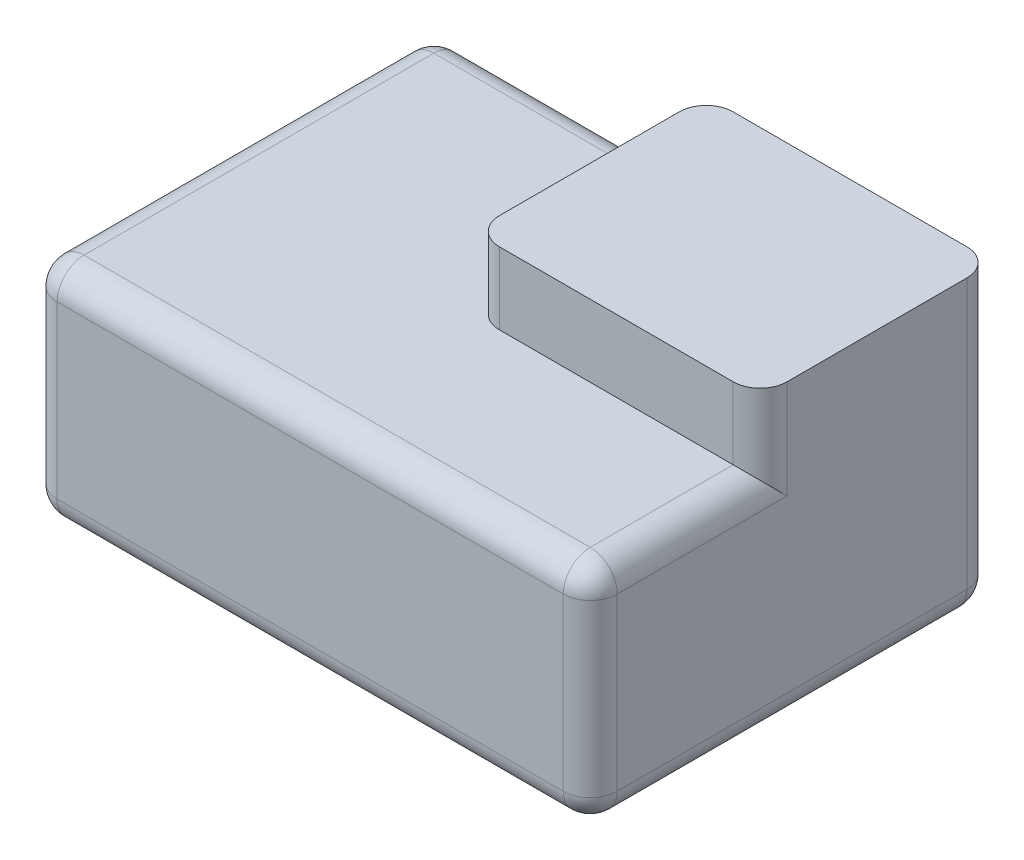
ISO-10303-21;
HEADER;
FILE_DESCRIPTION(('STEP AP214'),'2;1');
FILE_NAME('part.step','',(''),(''),'','','');
FILE_SCHEMA(('AUTOMOTIVE_DESIGN { 1 0 10303 214 1 1 1 1 }'));
ENDSEC;
DATA;
#1=APPLICATION_CONTEXT('core data for automotive mechanical design processes');
#2=APPLICATION_PROTOCOL_DEFINITION('international standard','automotive_design',2000,#1);
#3=PRODUCT_CONTEXT('',#1,'mechanical');
#4=PRODUCT('Part','Part','',(#3));
#5=PRODUCT_RELATED_PRODUCT_CATEGORY('part','',(#4));
#6=PRODUCT_DEFINITION_FORMATION('','',#4);
#7=PRODUCT_DEFINITION_CONTEXT('part definition',#1,'design');
#8=PRODUCT_DEFINITION('design','',#6,#7);
#9=PRODUCT_DEFINITION_SHAPE('','',#8);
#10=(LENGTH_UNIT() NAMED_UNIT(*) SI_UNIT(.MILLI.,.METRE.));
#11=(NAMED_UNIT(*) PLANE_ANGLE_UNIT() SI_UNIT($,.RADIAN.));
#12=(NAMED_UNIT(*) SI_UNIT($,.STERADIAN.) SOLID_ANGLE_UNIT());
#13=UNCERTAINTY_MEASURE_WITH_UNIT(LENGTH_MEASURE(1.E-05),#10,'distance_accuracy_value','');
#14=(GEOMETRIC_REPRESENTATION_CONTEXT(3) GLOBAL_UNCERTAINTY_ASSIGNED_CONTEXT((#13)) GLOBAL_UNIT_ASSIGNED_CONTEXT((#10,
#11,#12)) REPRESENTATION_CONTEXT('',''));
#15=CARTESIAN_POINT('',(0.,0.,0.));
#16=DIRECTION('',(0.,0.,1.));
#17=DIRECTION('',(1.,0.,0.));
#18=AXIS2_PLACEMENT_3D('',#15,#16,#17);
#19=CARTESIAN_POINT('',(0.,33.,0.));
#20=DIRECTION('',(1.,0.,0.));
#21=DIRECTION('',(0.,0.,-1.));
#22=AXIS2_PLACEMENT_3D('',#19,#20,#21);
#23=PLANE('',#22);
#24=DIRECTION('',(0.,0.,1.));
#25=VECTOR('',#24,1.);
#26=CARTESIAN_POINT('',(0.,22.,-44.9));
#27=LINE('',#26,#25);
#28=CARTESIAN_POINT('',(0.,22.,-3.));
#29=VERTEX_POINT('',#28);
#30=CARTESIAN_POINT('',(0.,22.,-41.9));
#31=VERTEX_POINT('',#30);
#32=EDGE_CURVE('E167',#29,#31,#27,.F.);
#33=ORIENTED_EDGE('',*,*,#32,.T.);
#34=DIRECTION('',(0.,-1.,0.));
#35=VECTOR('',#34,1.);
#36=CARTESIAN_POINT('',(0.,33.,-41.9));
#37=LINE('',#36,#35);
#38=CARTESIAN_POINT('',(0.,3.,-41.9));
#39=VERTEX_POINT('',#38);
#40=EDGE_CURVE('E163',#31,#39,#37,.T.);
#41=ORIENTED_EDGE('',*,*,#40,.T.);
#42=DIRECTION('',(0.,0.,1.));
#43=VECTOR('',#42,1.);
#44=CARTESIAN_POINT('',(0.,3.,0.));
#45=LINE('',#44,#43);
#46=CARTESIAN_POINT('',(0.,3.,-3.));
#47=VERTEX_POINT('',#46);
#48=EDGE_CURVE('E158',#39,#47,#45,.T.);
#49=ORIENTED_EDGE('',*,*,#48,.T.);
#50=DIRECTION('',(0.,-1.,0.));
#51=VECTOR('',#50,1.);
#52=CARTESIAN_POINT('',(0.,33.,-3.));
#53=LINE('',#52,#51);
#54=EDGE_CURVE('E160',#47,#29,#53,.F.);
#55=ORIENTED_EDGE('',*,*,#54,.T.);
#56=EDGE_LOOP('',(#33,#41,#49,#55));
#57=FACE_BOUND('',#56,.T.);
#58=ADVANCED_FACE('F34',(#57),#23,.F.);
#59=CARTESIAN_POINT('',(0.,33.,0.));
#60=DIRECTION('',(0.,0.,-1.));
#61=DIRECTION('',(-1.,0.,0.));
#62=AXIS2_PLACEMENT_3D('',#59,#60,#61);
#63=PLANE('',#62);
#64=DIRECTION('',(1.,0.,0.));
#65=VECTOR('',#64,1.);
#66=CARTESIAN_POINT('',(62.3,3.,0.));
#67=LINE('',#66,#65);
#68=CARTESIAN_POINT('',(3.,3.,0.));
#69=VERTEX_POINT('',#68);
#70=CARTESIAN_POINT('',(59.3,3.,0.));
#71=VERTEX_POINT('',#70);
#72=EDGE_CURVE('E297',#69,#71,#67,.T.);
#73=ORIENTED_EDGE('',*,*,#72,.T.);
#74=DIRECTION('',(0.,-1.,0.));
#75=VECTOR('',#74,1.);
#76=CARTESIAN_POINT('',(59.3,33.,0.));
#77=LINE('',#76,#75);
#78=CARTESIAN_POINT('',(59.3,22.,0.));
#79=VERTEX_POINT('',#78);
#80=EDGE_CURVE('E299',#71,#79,#77,.F.);
#81=ORIENTED_EDGE('',*,*,#80,.T.);
#82=DIRECTION('',(1.,0.,0.));
#83=VECTOR('',#82,1.);
#84=CARTESIAN_POINT('',(0.,22.,0.));
#85=LINE('',#84,#83);
#86=CARTESIAN_POINT('',(3.,22.,0.));
#87=VERTEX_POINT('',#86);
#88=EDGE_CURVE('E293',#79,#87,#85,.F.);
#89=ORIENTED_EDGE('',*,*,#88,.T.);
#90=DIRECTION('',(0.,-1.,0.));
#91=VECTOR('',#90,1.);
#92=CARTESIAN_POINT('',(3.,33.,0.));
#93=LINE('',#92,#91);
#94=EDGE_CURVE('E295',#87,#69,#93,.T.);
#95=ORIENTED_EDGE('',*,*,#94,.T.);
#96=EDGE_LOOP('',(#73,#81,#89,#95));
#97=FACE_BOUND('',#96,.T.);
#98=ADVANCED_FACE('F392',(#97),#63,.F.);
#99=CARTESIAN_POINT('',(0.,33.,-44.9));
#100=DIRECTION('',(0.,0.,1.));
#101=DIRECTION('',(1.,0.,0.));
#102=AXIS2_PLACEMENT_3D('',#99,#100,#101);
#103=PLANE('',#102);
#104=DIRECTION('',(-1.,0.,0.));
#105=VECTOR('',#104,1.);
#106=CARTESIAN_POINT('',(30.3,22.,-44.9));
#107=LINE('',#106,#105);
#108=CARTESIAN_POINT('',(3.,22.,-44.9));
#109=VERTEX_POINT('',#108);
#110=CARTESIAN_POINT('',(33.3,22.,-44.9));
#111=VERTEX_POINT('',#110);
#112=EDGE_CURVE('E263',#109,#111,#107,.F.);
#113=ORIENTED_EDGE('',*,*,#112,.T.);
#114=DIRECTION('',(0.,1.,0.));
#115=VECTOR('',#114,1.);
#116=CARTESIAN_POINT('',(33.3,33.,-44.9));
#117=LINE('',#116,#115);
#118=CARTESIAN_POINT('',(33.3,33.,-44.9));
#119=VERTEX_POINT('',#118);
#120=EDGE_CURVE('E265',#111,#119,#117,.T.);
#121=ORIENTED_EDGE('',*,*,#120,.T.);
#122=DIRECTION('',(-1.,0.,0.));
#123=VECTOR('',#122,1.);
#124=CARTESIAN_POINT('',(0.,33.,-44.9));
#125=LINE('',#124,#123);
#126=CARTESIAN_POINT('',(59.3,33.,-44.9));
#127=VERTEX_POINT('',#126);
#128=EDGE_CURVE('E179',#127,#119,#125,.T.);
#129=ORIENTED_EDGE('',*,*,#128,.F.);
#130=DIRECTION('',(0.,-1.,0.));
#131=VECTOR('',#130,1.);
#132=CARTESIAN_POINT('',(59.3,33.,-44.9));
#133=LINE('',#132,#131);
#134=CARTESIAN_POINT('',(59.3,3.,-44.9));
#135=VERTEX_POINT('',#134);
#136=EDGE_CURVE('E256',#127,#135,#133,.T.);
#137=ORIENTED_EDGE('',*,*,#136,.T.);
#138=DIRECTION('',(-1.,0.,0.));
#139=VECTOR('',#138,1.);
#140=CARTESIAN_POINT('',(0.,3.,-44.9));
#141=LINE('',#140,#139);
#142=CARTESIAN_POINT('',(3.,3.,-44.9));
#143=VERTEX_POINT('',#142);
#144=EDGE_CURVE('E258',#135,#143,#141,.T.);
#145=ORIENTED_EDGE('',*,*,#144,.T.);
#146=DIRECTION('',(0.,-1.,0.));
#147=VECTOR('',#146,1.);
#148=CARTESIAN_POINT('',(3.,33.,-44.9));
#149=LINE('',#148,#147);
#150=EDGE_CURVE('E260',#143,#109,#149,.F.);
#151=ORIENTED_EDGE('',*,*,#150,.T.);
#152=EDGE_LOOP('',(#113,#121,#129,#137,#145,#151));
#153=FACE_BOUND('',#152,.T.);
#154=ADVANCED_FACE('F342',(#153),#103,.F.);
#155=CARTESIAN_POINT('',(0.,33.,0.));
#156=DIRECTION('',(0.,-1.,0.));
#157=DIRECTION('',(0.,0.,-1.));
#158=AXIS2_PLACEMENT_3D('',#155,#156,#157);
#159=PLANE('',#158);
#160=ORIENTED_EDGE('',*,*,#128,.T.);
#161=CARTESIAN_POINT('',(33.3,33.,-41.9));
#162=DIRECTION('',(0.,-1.,0.));
#163=DIRECTION('',(0.,0.,-1.));
#164=AXIS2_PLACEMENT_3D('',#161,#162,#163);
#165=CIRCLE('',#164,3.);
#166=CARTESIAN_POINT('',(30.3,33.,-41.9));
#167=VERTEX_POINT('',#166);
#168=EDGE_CURVE('E307',#119,#167,#165,.F.);
#169=ORIENTED_EDGE('',*,*,#168,.T.);
#170=DIRECTION('',(0.,0.,1.));
#171=VECTOR('',#170,1.);
#172=CARTESIAN_POINT('',(30.3,33.,0.));
#173=LINE('',#172,#171);
#174=CARTESIAN_POINT('',(30.3,33.,-21.9));
#175=VERTEX_POINT('',#174);
#176=EDGE_CURVE('E235',#167,#175,#173,.T.);
#177=ORIENTED_EDGE('',*,*,#176,.T.);
#178=CARTESIAN_POINT('',(33.3,33.,-21.9));
#179=DIRECTION('',(0.,-1.,0.));
#180=DIRECTION('',(0.,0.,-1.));
#181=AXIS2_PLACEMENT_3D('',#178,#179,#180);
#182=CIRCLE('',#181,3.);
#183=CARTESIAN_POINT('',(33.3,33.,-18.9));
#184=VERTEX_POINT('',#183);
#185=EDGE_CURVE('E51',#175,#184,#182,.F.);
#186=ORIENTED_EDGE('',*,*,#185,.T.);
#187=DIRECTION('',(-1.,0.,0.));
#188=VECTOR('',#187,1.);
#189=CARTESIAN_POINT('',(0.,33.,-18.9));
#190=LINE('',#189,#188);
#191=CARTESIAN_POINT('',(59.3,33.,-18.9));
#192=VERTEX_POINT('',#191);
#193=EDGE_CURVE('E240',#192,#184,#190,.T.);
#194=ORIENTED_EDGE('',*,*,#193,.F.);
#195=CARTESIAN_POINT('',(59.3,33.,-21.9));
#196=DIRECTION('',(0.,-1.,0.));
#197=DIRECTION('',(0.,0.,-1.));
#198=AXIS2_PLACEMENT_3D('',#195,#196,#197);
#199=CIRCLE('',#198,3.);
#200=CARTESIAN_POINT('',(62.3,33.,-21.9));
#201=VERTEX_POINT('',#200);
#202=EDGE_CURVE('E302',#192,#201,#199,.F.);
#203=ORIENTED_EDGE('',*,*,#202,.T.);
#204=DIRECTION('',(0.,0.,-1.));
#205=VECTOR('',#204,1.);
#206=CARTESIAN_POINT('',(62.3,33.,0.));
#207=LINE('',#206,#205);
#208=CARTESIAN_POINT('',(62.3,33.,-41.9));
#209=VERTEX_POINT('',#208);
#210=EDGE_CURVE('E249',#201,#209,#207,.T.);
#211=ORIENTED_EDGE('',*,*,#210,.T.);
#212=CARTESIAN_POINT('',(59.3,33.,-41.9));
#213=DIRECTION('',(0.,-1.,0.));
#214=DIRECTION('',(0.,0.,-1.));
#215=AXIS2_PLACEMENT_3D('',#212,#213,#214);
#216=CIRCLE('',#215,3.);
#217=EDGE_CURVE('E304',#209,#127,#216,.F.);
#218=ORIENTED_EDGE('',*,*,#217,.T.);
#219=EDGE_LOOP('',(#160,#169,#177,#186,#194,#203,#211,#218));
#220=FACE_BOUND('',#219,.T.);
#221=ADVANCED_FACE('F374',(#220),#159,.F.);
#222=CARTESIAN_POINT('',(62.3,33.,0.));
#223=DIRECTION('',(-1.,0.,0.));
#224=DIRECTION('',(0.,0.,1.));
#225=AXIS2_PLACEMENT_3D('',#222,#223,#224);
#226=PLANE('',#225);
#227=DIRECTION('',(0.,0.,-1.));
#228=VECTOR('',#227,1.);
#229=CARTESIAN_POINT('',(62.3,3.,-44.9));
#230=LINE('',#229,#228);
#231=CARTESIAN_POINT('',(62.3,3.,-3.));
#232=VERTEX_POINT('',#231);
#233=CARTESIAN_POINT('',(62.3,3.,-41.9));
#234=VERTEX_POINT('',#233);
#235=EDGE_CURVE('E281',#232,#234,#230,.T.);
#236=ORIENTED_EDGE('',*,*,#235,.T.);
#237=DIRECTION('',(0.,-1.,0.));
#238=VECTOR('',#237,1.);
#239=CARTESIAN_POINT('',(62.3,33.,-41.9));
#240=LINE('',#239,#238);
#241=EDGE_CURVE('E283',#234,#209,#240,.F.);
#242=ORIENTED_EDGE('',*,*,#241,.T.);
#243=ORIENTED_EDGE('',*,*,#210,.F.);
#244=DIRECTION('',(0.,1.,0.));
#245=VECTOR('',#244,1.);
#246=CARTESIAN_POINT('',(62.3,33.,-21.9));
#247=LINE('',#246,#245);
#248=CARTESIAN_POINT('',(62.3,22.,-21.9));
#249=VERTEX_POINT('',#248);
#250=EDGE_CURVE('E275',#201,#249,#247,.F.);
#251=ORIENTED_EDGE('',*,*,#250,.T.);
#252=DIRECTION('',(0.,0.,-1.));
#253=VECTOR('',#252,1.);
#254=CARTESIAN_POINT('',(62.3,22.,0.));
#255=LINE('',#254,#253);
#256=CARTESIAN_POINT('',(62.3,22.,-3.));
#257=VERTEX_POINT('',#256);
#258=EDGE_CURVE('E277',#249,#257,#255,.F.);
#259=ORIENTED_EDGE('',*,*,#258,.T.);
#260=DIRECTION('',(0.,-1.,0.));
#261=VECTOR('',#260,1.);
#262=CARTESIAN_POINT('',(62.3,33.,-3.));
#263=LINE('',#262,#261);
#264=EDGE_CURVE('E279',#257,#232,#263,.T.);
#265=ORIENTED_EDGE('',*,*,#264,.T.);
#266=EDGE_LOOP('',(#236,#242,#243,#251,#259,#265));
#267=FACE_BOUND('',#266,.T.);
#268=ADVANCED_FACE('F372',(#267),#226,.F.);
#269=CARTESIAN_POINT('',(0.,0.,0.));
#270=DIRECTION('',(0.,-1.,0.));
#271=DIRECTION('',(0.,0.,-1.));
#272=AXIS2_PLACEMENT_3D('',#269,#270,#271);
#273=PLANE('',#272);
#274=DIRECTION('',(-1.,0.,0.));
#275=VECTOR('',#274,1.);
#276=CARTESIAN_POINT('',(62.3,0.,-41.9));
#277=LINE('',#276,#275);
#278=CARTESIAN_POINT('',(3.,0.,-41.9));
#279=VERTEX_POINT('',#278);
#280=CARTESIAN_POINT('',(59.3,0.,-41.9));
#281=VERTEX_POINT('',#280);
#282=EDGE_CURVE('E288',#279,#281,#277,.F.);
#283=ORIENTED_EDGE('',*,*,#282,.T.);
#284=DIRECTION('',(0.,0.,-1.));
#285=VECTOR('',#284,1.);
#286=CARTESIAN_POINT('',(59.3,0.,0.));
#287=LINE('',#286,#285);
#288=CARTESIAN_POINT('',(59.3,0.,-3.));
#289=VERTEX_POINT('',#288);
#290=EDGE_CURVE('E290',#281,#289,#287,.F.);
#291=ORIENTED_EDGE('',*,*,#290,.T.);
#292=DIRECTION('',(1.,0.,0.));
#293=VECTOR('',#292,1.);
#294=CARTESIAN_POINT('',(0.,0.,-3.));
#295=LINE('',#294,#293);
#296=CARTESIAN_POINT('',(3.,0.,-3.));
#297=VERTEX_POINT('',#296);
#298=EDGE_CURVE('E285',#289,#297,#295,.F.);
#299=ORIENTED_EDGE('',*,*,#298,.T.);
#300=DIRECTION('',(0.,0.,1.));
#301=VECTOR('',#300,1.);
#302=CARTESIAN_POINT('',(3.,0.,-44.9));
#303=LINE('',#302,#301);
#304=EDGE_CURVE('E190',#297,#279,#303,.F.);
#305=ORIENTED_EDGE('',*,*,#304,.T.);
#306=EDGE_LOOP('',(#283,#291,#299,#305));
#307=FACE_BOUND('',#306,.T.);
#308=ADVANCED_FACE('F356',(#307),#273,.T.);
#309=CARTESIAN_POINT('',(30.3,25.,0.));
#310=DIRECTION('',(-1.,0.,0.));
#311=DIRECTION('',(0.,0.,1.));
#312=AXIS2_PLACEMENT_3D('',#309,#310,#311);
#313=PLANE('',#312);
#314=ORIENTED_EDGE('',*,*,#176,.F.);
#315=DIRECTION('',(0.,1.,0.));
#316=VECTOR('',#315,1.);
#317=CARTESIAN_POINT('',(30.3,25.,-41.9));
#318=LINE('',#317,#316);
#319=CARTESIAN_POINT('',(30.3,25.,-41.9));
#320=VERTEX_POINT('',#319);
#321=EDGE_CURVE('E312',#167,#320,#318,.F.);
#322=ORIENTED_EDGE('',*,*,#321,.T.);
#323=DIRECTION('',(0.,0.,1.));
#324=VECTOR('',#323,1.);
#325=CARTESIAN_POINT('',(30.3,25.,0.));
#326=LINE('',#325,#324);
#327=CARTESIAN_POINT('',(30.3,25.,-21.9));
#328=VERTEX_POINT('',#327);
#329=EDGE_CURVE('E243',#320,#328,#326,.T.);
#330=ORIENTED_EDGE('',*,*,#329,.T.);
#331=DIRECTION('',(0.,1.,0.));
#332=VECTOR('',#331,1.);
#333=CARTESIAN_POINT('',(30.3,33.,-21.9));
#334=LINE('',#333,#332);
#335=EDGE_CURVE('E309',#328,#175,#334,.T.);
#336=ORIENTED_EDGE('',*,*,#335,.T.);
#337=EDGE_LOOP('',(#314,#322,#330,#336));
#338=FACE_BOUND('',#337,.T.);
#339=ADVANCED_FACE('F596',(#338),#313,.T.);
#340=CARTESIAN_POINT('',(0.,25.,-18.9));
#341=DIRECTION('',(0.,0.,-1.));
#342=DIRECTION('',(-1.,0.,0.));
#343=AXIS2_PLACEMENT_3D('',#340,#341,#342);
#344=PLANE('',#343);
#345=ORIENTED_EDGE('',*,*,#193,.T.);
#346=DIRECTION('',(0.,1.,0.));
#347=VECTOR('',#346,1.);
#348=CARTESIAN_POINT('',(33.3,25.,-18.9));
#349=LINE('',#348,#347);
#350=CARTESIAN_POINT('',(33.3,25.,-18.9));
#351=VERTEX_POINT('',#350);
#352=EDGE_CURVE('E43',#184,#351,#349,.F.);
#353=ORIENTED_EDGE('',*,*,#352,.T.);
#354=DIRECTION('',(-1.,0.,0.));
#355=VECTOR('',#354,1.);
#356=CARTESIAN_POINT('',(0.,25.,-18.9));
#357=LINE('',#356,#355);
#358=CARTESIAN_POINT('',(59.3,25.,-18.9));
#359=VERTEX_POINT('',#358);
#360=EDGE_CURVE('E246',#359,#351,#357,.T.);
#361=ORIENTED_EDGE('',*,*,#360,.F.);
#362=DIRECTION('',(0.,1.,0.));
#363=VECTOR('',#362,1.);
#364=CARTESIAN_POINT('',(59.3,25.,-18.9));
#365=LINE('',#364,#363);
#366=EDGE_CURVE('E58',#359,#192,#365,.T.);
#367=ORIENTED_EDGE('',*,*,#366,.T.);
#368=EDGE_LOOP('',(#345,#353,#361,#367));
#369=FACE_BOUND('',#368,.T.);
#370=ADVANCED_FACE('F587',(#369),#344,.F.);
#371=CARTESIAN_POINT('',(0.,25.,0.));
#372=DIRECTION('',(0.,1.,0.));
#373=DIRECTION('',(0.,0.,1.));
#374=AXIS2_PLACEMENT_3D('',#371,#372,#373);
#375=PLANE('',#374);
#376=DIRECTION('',(1.,0.,0.));
#377=VECTOR('',#376,1.);
#378=CARTESIAN_POINT('',(62.3,25.,-3.));
#379=LINE('',#378,#377);
#380=CARTESIAN_POINT('',(3.,25.,-3.));
#381=VERTEX_POINT('',#380);
#382=CARTESIAN_POINT('',(59.3,25.,-3.));
#383=VERTEX_POINT('',#382);
#384=EDGE_CURVE('E271',#381,#383,#379,.T.);
#385=ORIENTED_EDGE('',*,*,#384,.T.);
#386=DIRECTION('',(0.,0.,-1.));
#387=VECTOR('',#386,1.);
#388=CARTESIAN_POINT('',(59.3,25.,-18.9));
#389=LINE('',#388,#387);
#390=EDGE_CURVE('E273',#383,#359,#389,.T.);
#391=ORIENTED_EDGE('',*,*,#390,.T.);
#392=ORIENTED_EDGE('',*,*,#360,.T.);
#393=CARTESIAN_POINT('',(33.3,25.,-21.9));
#394=DIRECTION('',(0.,1.,0.));
#395=DIRECTION('',(0.,0.,1.));
#396=AXIS2_PLACEMENT_3D('',#393,#394,#395);
#397=CIRCLE('',#396,3.);
#398=EDGE_CURVE('E11',#351,#328,#397,.F.);
#399=ORIENTED_EDGE('',*,*,#398,.T.);
#400=ORIENTED_EDGE('',*,*,#329,.F.);
#401=DIRECTION('',(-1.,0.,0.));
#402=VECTOR('',#401,1.);
#403=CARTESIAN_POINT('',(0.,25.,-41.9));
#404=LINE('',#403,#402);
#405=CARTESIAN_POINT('',(3.,25.,-41.9));
#406=VERTEX_POINT('',#405);
#407=EDGE_CURVE('E267',#320,#406,#404,.T.);
#408=ORIENTED_EDGE('',*,*,#407,.T.);
#409=DIRECTION('',(0.,0.,1.));
#410=VECTOR('',#409,1.);
#411=CARTESIAN_POINT('',(3.,25.,0.));
#412=LINE('',#411,#410);
#413=EDGE_CURVE('E269',#406,#381,#412,.T.);
#414=ORIENTED_EDGE('',*,*,#413,.T.);
#415=EDGE_LOOP('',(#385,#391,#392,#399,#400,#408,#414));
#416=FACE_BOUND('',#415,.T.);
#417=ADVANCED_FACE('F580',(#416),#375,.T.);
#418=CARTESIAN_POINT('',(59.3,25.,-21.9));
#419=DIRECTION('',(0.,1.,0.));
#420=DIRECTION('',(0.,0.,1.));
#421=AXIS2_PLACEMENT_3D('',#418,#419,#420);
#422=CYLINDRICAL_SURFACE('',#421,3.);
#423=ORIENTED_EDGE('',*,*,#202,.F.);
#424=ORIENTED_EDGE('',*,*,#366,.F.);
#425=CARTESIAN_POINT('',(59.3,22.,-21.9));
#426=DIRECTION('',(0.,-0.707106781186547,0.707106781186547));
#427=DIRECTION('',(0.,0.707106781186547,0.707106781186547));
#428=AXIS2_PLACEMENT_3D('',#425,#426,#427);
#429=ELLIPSE('',#428,4.24264068711928,3.);
#430=EDGE_CURVE('E38',#249,#359,#429,.T.);
#431=ORIENTED_EDGE('',*,*,#430,.F.);
#432=ORIENTED_EDGE('',*,*,#250,.F.);
#433=EDGE_LOOP('',(#423,#424,#431,#432));
#434=FACE_BOUND('',#433,.T.);
#435=ADVANCED_FACE('F378',(#434),#422,.T.);
#436=CARTESIAN_POINT('',(59.3,22.,0.));
#437=DIRECTION('',(0.,0.,1.));
#438=DIRECTION('',(1.,0.,0.));
#439=AXIS2_PLACEMENT_3D('',#436,#437,#438);
#440=CYLINDRICAL_SURFACE('',#439,3.);
#441=ORIENTED_EDGE('',*,*,#430,.T.);
#442=ORIENTED_EDGE('',*,*,#390,.F.);
#443=CARTESIAN_POINT('',(59.3,22.,-3.));
#444=DIRECTION('',(0.,0.,1.));
#445=DIRECTION('',(1.,0.,0.));
#446=AXIS2_PLACEMENT_3D('',#443,#444,#445);
#447=CIRCLE('',#446,3.);
#448=EDGE_CURVE('E229',#257,#383,#447,.T.);
#449=ORIENTED_EDGE('',*,*,#448,.F.);
#450=ORIENTED_EDGE('',*,*,#258,.F.);
#451=EDGE_LOOP('',(#441,#442,#449,#450));
#452=FACE_BOUND('',#451,.T.);
#453=ADVANCED_FACE('F385',(#452),#440,.T.);
#454=CARTESIAN_POINT('',(59.3,33.,-3.));
#455=DIRECTION('',(0.,-1.,0.));
#456=DIRECTION('',(0.,0.,-1.));
#457=AXIS2_PLACEMENT_3D('',#454,#455,#456);
#458=CYLINDRICAL_SURFACE('',#457,3.);
#459=CARTESIAN_POINT('',(59.3,3.,-3.));
#460=DIRECTION('',(0.,-1.,0.));
#461=DIRECTION('',(0.,0.,-1.));
#462=AXIS2_PLACEMENT_3D('',#459,#460,#461);
#463=CIRCLE('',#462,3.);
#464=EDGE_CURVE('E224',#232,#71,#463,.T.);
#465=ORIENTED_EDGE('',*,*,#464,.F.);
#466=ORIENTED_EDGE('',*,*,#264,.F.);
#467=CARTESIAN_POINT('',(59.3,22.,-3.));
#468=DIRECTION('',(0.,1.,0.));
#469=DIRECTION('',(0.,0.,1.));
#470=AXIS2_PLACEMENT_3D('',#467,#468,#469);
#471=CIRCLE('',#470,3.);
#472=EDGE_CURVE('E227',#79,#257,#471,.T.);
#473=ORIENTED_EDGE('',*,*,#472,.F.);
#474=ORIENTED_EDGE('',*,*,#80,.F.);
#475=EDGE_LOOP('',(#465,#466,#473,#474));
#476=FACE_BOUND('',#475,.T.);
#477=ADVANCED_FACE('F383',(#476),#458,.T.);
#478=CARTESIAN_POINT('',(59.3,22.,-3.));
#479=DIRECTION('',(0.,0.,1.));
#480=DIRECTION('',(1.,0.,0.));
#481=AXIS2_PLACEMENT_3D('',#478,#479,#480);
#482=SPHERICAL_SURFACE('',#481,3.);
#483=ORIENTED_EDGE('',*,*,#472,.T.);
#484=ORIENTED_EDGE('',*,*,#448,.T.);
#485=CARTESIAN_POINT('',(59.3,22.,-3.));
#486=DIRECTION('',(1.,0.,0.));
#487=DIRECTION('',(0.,0.,-1.));
#488=AXIS2_PLACEMENT_3D('',#485,#486,#487);
#489=CIRCLE('',#488,3.);
#490=EDGE_CURVE('E221',#79,#383,#489,.F.);
#491=ORIENTED_EDGE('',*,*,#490,.F.);
#492=EDGE_LOOP('',(#483,#484,#491));
#493=FACE_BOUND('',#492,.T.);
#494=ADVANCED_FACE('F386',(#493),#482,.T.);
#495=CARTESIAN_POINT('',(59.3,3.,-3.));
#496=DIRECTION('',(0.,0.,1.));
#497=DIRECTION('',(1.,0.,0.));
#498=AXIS2_PLACEMENT_3D('',#495,#496,#497);
#499=SPHERICAL_SURFACE('',#498,3.);
#500=CARTESIAN_POINT('',(59.3,3.,-3.));
#501=DIRECTION('',(0.,0.,1.));
#502=DIRECTION('',(1.,0.,0.));
#503=AXIS2_PLACEMENT_3D('',#500,#501,#502);
#504=CIRCLE('',#503,3.);
#505=EDGE_CURVE('E215',#232,#289,#504,.F.);
#506=ORIENTED_EDGE('',*,*,#505,.F.);
#507=ORIENTED_EDGE('',*,*,#464,.T.);
#508=CARTESIAN_POINT('',(59.3,3.,-3.));
#509=DIRECTION('',(1.,0.,0.));
#510=DIRECTION('',(0.,0.,-1.));
#511=AXIS2_PLACEMENT_3D('',#508,#509,#510);
#512=CIRCLE('',#511,3.);
#513=EDGE_CURVE('E218',#289,#71,#512,.F.);
#514=ORIENTED_EDGE('',*,*,#513,.F.);
#515=EDGE_LOOP('',(#506,#507,#514));
#516=FACE_BOUND('',#515,.T.);
#517=ADVANCED_FACE('F396',(#516),#499,.T.);
#518=CARTESIAN_POINT('',(0.,22.,-3.));
#519=DIRECTION('',(-1.,0.,0.));
#520=DIRECTION('',(0.,0.,1.));
#521=AXIS2_PLACEMENT_3D('',#518,#519,#520);
#522=CYLINDRICAL_SURFACE('',#521,3.);
#523=ORIENTED_EDGE('',*,*,#490,.T.);
#524=ORIENTED_EDGE('',*,*,#384,.F.);
#525=CARTESIAN_POINT('',(3.,22.,-3.));
#526=DIRECTION('',(-1.,0.,0.));
#527=DIRECTION('',(0.,0.,1.));
#528=AXIS2_PLACEMENT_3D('',#525,#526,#527);
#529=CIRCLE('',#528,3.);
#530=EDGE_CURVE('E212',#87,#381,#529,.T.);
#531=ORIENTED_EDGE('',*,*,#530,.F.);
#532=ORIENTED_EDGE('',*,*,#88,.F.);
#533=EDGE_LOOP('',(#523,#524,#531,#532));
#534=FACE_BOUND('',#533,.T.);
#535=ADVANCED_FACE('F389',(#534),#522,.T.);
#536=CARTESIAN_POINT('',(3.,33.,-3.));
#537=DIRECTION('',(0.,-1.,0.));
#538=DIRECTION('',(0.,0.,-1.));
#539=AXIS2_PLACEMENT_3D('',#536,#537,#538);
#540=CYLINDRICAL_SURFACE('',#539,3.);
#541=CARTESIAN_POINT('',(3.,3.,-3.));
#542=DIRECTION('',(0.,-1.,0.));
#543=DIRECTION('',(0.,0.,-1.));
#544=AXIS2_PLACEMENT_3D('',#541,#542,#543);
#545=CIRCLE('',#544,3.);
#546=EDGE_CURVE('E174',#69,#47,#545,.T.);
#547=ORIENTED_EDGE('',*,*,#546,.F.);
#548=ORIENTED_EDGE('',*,*,#94,.F.);
#549=CARTESIAN_POINT('',(3.,22.,-3.));
#550=DIRECTION('',(0.,1.,0.));
#551=DIRECTION('',(0.,0.,1.));
#552=AXIS2_PLACEMENT_3D('',#549,#550,#551);
#553=CIRCLE('',#552,3.);
#554=EDGE_CURVE('E177',#29,#87,#553,.T.);
#555=ORIENTED_EDGE('',*,*,#554,.F.);
#556=ORIENTED_EDGE('',*,*,#54,.F.);
#557=EDGE_LOOP('',(#547,#548,#555,#556));
#558=FACE_BOUND('',#557,.T.);
#559=ADVANCED_FACE('F172',(#558),#540,.T.);
#560=CARTESIAN_POINT('',(0.,3.,-3.));
#561=DIRECTION('',(-1.,0.,0.));
#562=DIRECTION('',(0.,0.,1.));
#563=AXIS2_PLACEMENT_3D('',#560,#561,#562);
#564=CYLINDRICAL_SURFACE('',#563,3.);
#565=ORIENTED_EDGE('',*,*,#513,.T.);
#566=ORIENTED_EDGE('',*,*,#72,.F.);
#567=CARTESIAN_POINT('',(3.,3.,-3.));
#568=DIRECTION('',(-1.,0.,0.));
#569=DIRECTION('',(0.,0.,1.));
#570=AXIS2_PLACEMENT_3D('',#567,#568,#569);
#571=CIRCLE('',#570,3.);
#572=EDGE_CURVE('E187',#297,#69,#571,.T.);
#573=ORIENTED_EDGE('',*,*,#572,.F.);
#574=ORIENTED_EDGE('',*,*,#298,.F.);
#575=EDGE_LOOP('',(#565,#566,#573,#574));
#576=FACE_BOUND('',#575,.T.);
#577=ADVANCED_FACE('F398',(#576),#564,.T.);
#578=CARTESIAN_POINT('',(59.3,3.,0.));
#579=DIRECTION('',(0.,0.,1.));
#580=DIRECTION('',(1.,0.,0.));
#581=AXIS2_PLACEMENT_3D('',#578,#579,#580);
#582=CYLINDRICAL_SURFACE('',#581,3.);
#583=ORIENTED_EDGE('',*,*,#505,.T.);
#584=ORIENTED_EDGE('',*,*,#290,.F.);
#585=CARTESIAN_POINT('',(59.3,3.,-41.9));
#586=DIRECTION('',(0.,0.,-1.));
#587=DIRECTION('',(-1.,0.,0.));
#588=AXIS2_PLACEMENT_3D('',#585,#586,#587);
#589=CIRCLE('',#588,3.);
#590=EDGE_CURVE('E207',#234,#281,#589,.T.);
#591=ORIENTED_EDGE('',*,*,#590,.F.);
#592=ORIENTED_EDGE('',*,*,#235,.F.);
#593=EDGE_LOOP('',(#583,#584,#591,#592));
#594=FACE_BOUND('',#593,.T.);
#595=ADVANCED_FACE('F359',(#594),#582,.T.);
#596=CARTESIAN_POINT('',(59.3,33.,-41.9));
#597=DIRECTION('',(0.,-1.,0.));
#598=DIRECTION('',(0.,0.,-1.));
#599=AXIS2_PLACEMENT_3D('',#596,#597,#598);
#600=CYLINDRICAL_SURFACE('',#599,3.);
#601=ORIENTED_EDGE('',*,*,#217,.F.);
#602=ORIENTED_EDGE('',*,*,#241,.F.);
#603=CARTESIAN_POINT('',(59.3,3.,-41.9));
#604=DIRECTION('',(0.,-1.,0.));
#605=DIRECTION('',(0.,0.,-1.));
#606=AXIS2_PLACEMENT_3D('',#603,#604,#605);
#607=CIRCLE('',#606,3.);
#608=EDGE_CURVE('E204',#135,#234,#607,.T.);
#609=ORIENTED_EDGE('',*,*,#608,.F.);
#610=ORIENTED_EDGE('',*,*,#136,.F.);
#611=EDGE_LOOP('',(#601,#602,#609,#610));
#612=FACE_BOUND('',#611,.T.);
#613=ADVANCED_FACE('F369',(#612),#600,.T.);
#614=CARTESIAN_POINT('',(33.3,33.,-41.9));
#615=DIRECTION('',(0.,-1.,0.));
#616=DIRECTION('',(0.,0.,-1.));
#617=AXIS2_PLACEMENT_3D('',#614,#615,#616);
#618=CYLINDRICAL_SURFACE('',#617,3.);
#619=ORIENTED_EDGE('',*,*,#168,.F.);
#620=ORIENTED_EDGE('',*,*,#120,.F.);
#621=CARTESIAN_POINT('',(33.3,22.,-41.9));
#622=DIRECTION('',(-0.707106781186547,-0.707106781186547,0.));
#623=DIRECTION('',(0.707106781186547,-0.707106781186547,0.));
#624=AXIS2_PLACEMENT_3D('',#621,#622,#623);
#625=ELLIPSE('',#624,4.24264068711928,3.);
#626=EDGE_CURVE('E195',#320,#111,#625,.T.);
#627=ORIENTED_EDGE('',*,*,#626,.F.);
#628=ORIENTED_EDGE('',*,*,#321,.F.);
#629=EDGE_LOOP('',(#619,#620,#627,#628));
#630=FACE_BOUND('',#629,.T.);
#631=ADVANCED_FACE('F438',(#630),#618,.T.);
#632=CARTESIAN_POINT('',(3.,22.,-3.));
#633=DIRECTION('',(0.,0.,1.));
#634=DIRECTION('',(1.,0.,0.));
#635=AXIS2_PLACEMENT_3D('',#632,#633,#634);
#636=SPHERICAL_SURFACE('',#635,3.);
#637=ORIENTED_EDGE('',*,*,#554,.T.);
#638=ORIENTED_EDGE('',*,*,#530,.T.);
#639=CARTESIAN_POINT('',(3.,22.,-3.));
#640=DIRECTION('',(0.,0.,1.));
#641=DIRECTION('',(1.,0.,0.));
#642=AXIS2_PLACEMENT_3D('',#639,#640,#641);
#643=CIRCLE('',#642,3.);
#644=EDGE_CURVE('E191',#29,#381,#643,.F.);
#645=ORIENTED_EDGE('',*,*,#644,.F.);
#646=EDGE_LOOP('',(#637,#638,#645));
#647=FACE_BOUND('',#646,.T.);
#648=ADVANCED_FACE('F435',(#647),#636,.T.);
#649=CARTESIAN_POINT('',(3.,3.,-3.));
#650=DIRECTION('',(0.,0.,1.));
#651=DIRECTION('',(1.,0.,0.));
#652=AXIS2_PLACEMENT_3D('',#649,#650,#651);
#653=SPHERICAL_SURFACE('',#652,3.);
#654=ORIENTED_EDGE('',*,*,#572,.T.);
#655=ORIENTED_EDGE('',*,*,#546,.T.);
#656=CARTESIAN_POINT('',(3.,3.,-3.));
#657=DIRECTION('',(0.,0.,1.));
#658=DIRECTION('',(1.,0.,0.));
#659=AXIS2_PLACEMENT_3D('',#656,#657,#658);
#660=CIRCLE('',#659,3.);
#661=EDGE_CURVE('E184',#297,#47,#660,.F.);
#662=ORIENTED_EDGE('',*,*,#661,.F.);
#663=EDGE_LOOP('',(#654,#655,#662));
#664=FACE_BOUND('',#663,.T.);
#665=ADVANCED_FACE('F183',(#664),#653,.T.);
#666=CARTESIAN_POINT('',(59.3,3.,-41.9));
#667=DIRECTION('',(0.,0.,1.));
#668=DIRECTION('',(1.,0.,0.));
#669=AXIS2_PLACEMENT_3D('',#666,#667,#668);
#670=SPHERICAL_SURFACE('',#669,3.);
#671=ORIENTED_EDGE('',*,*,#608,.T.);
#672=ORIENTED_EDGE('',*,*,#590,.T.);
#673=CARTESIAN_POINT('',(59.3,3.,-41.9));
#674=DIRECTION('',(1.,0.,0.));
#675=DIRECTION('',(0.,0.,-1.));
#676=AXIS2_PLACEMENT_3D('',#673,#674,#675);
#677=CIRCLE('',#676,3.);
#678=EDGE_CURVE('E192',#135,#281,#677,.F.);
#679=ORIENTED_EDGE('',*,*,#678,.F.);
#680=EDGE_LOOP('',(#671,#672,#679));
#681=FACE_BOUND('',#680,.T.);
#682=ADVANCED_FACE('F363',(#681),#670,.T.);
#683=CARTESIAN_POINT('',(0.,22.,-41.9));
#684=DIRECTION('',(1.,0.,0.));
#685=DIRECTION('',(0.,0.,-1.));
#686=AXIS2_PLACEMENT_3D('',#683,#684,#685);
#687=CYLINDRICAL_SURFACE('',#686,3.);
#688=ORIENTED_EDGE('',*,*,#626,.T.);
#689=ORIENTED_EDGE('',*,*,#112,.F.);
#690=CARTESIAN_POINT('',(3.,22.,-41.9));
#691=DIRECTION('',(-1.,0.,0.));
#692=DIRECTION('',(0.,0.,1.));
#693=AXIS2_PLACEMENT_3D('',#690,#691,#692);
#694=CIRCLE('',#693,3.);
#695=EDGE_CURVE('E198',#406,#109,#694,.T.);
#696=ORIENTED_EDGE('',*,*,#695,.F.);
#697=ORIENTED_EDGE('',*,*,#407,.F.);
#698=EDGE_LOOP('',(#688,#689,#696,#697));
#699=FACE_BOUND('',#698,.T.);
#700=ADVANCED_FACE('F337',(#699),#687,.T.);
#701=CARTESIAN_POINT('',(3.,22.,0.));
#702=DIRECTION('',(0.,0.,-1.));
#703=DIRECTION('',(-1.,0.,0.));
#704=AXIS2_PLACEMENT_3D('',#701,#702,#703);
#705=CYLINDRICAL_SURFACE('',#704,3.);
#706=ORIENTED_EDGE('',*,*,#644,.T.);
#707=ORIENTED_EDGE('',*,*,#413,.F.);
#708=CARTESIAN_POINT('',(3.,22.,-41.9));
#709=DIRECTION('',(0.,0.,-1.));
#710=DIRECTION('',(-1.,0.,0.));
#711=AXIS2_PLACEMENT_3D('',#708,#709,#710);
#712=CIRCLE('',#711,3.);
#713=EDGE_CURVE('E326',#31,#406,#712,.T.);
#714=ORIENTED_EDGE('',*,*,#713,.F.);
#715=ORIENTED_EDGE('',*,*,#32,.F.);
#716=EDGE_LOOP('',(#706,#707,#714,#715));
#717=FACE_BOUND('',#716,.T.);
#718=ADVANCED_FACE('F425',(#717),#705,.T.);
#719=CARTESIAN_POINT('',(3.,3.,0.));
#720=DIRECTION('',(0.,0.,-1.));
#721=DIRECTION('',(-1.,0.,0.));
#722=AXIS2_PLACEMENT_3D('',#719,#720,#721);
#723=CYLINDRICAL_SURFACE('',#722,3.);
#724=ORIENTED_EDGE('',*,*,#661,.T.);
#725=ORIENTED_EDGE('',*,*,#48,.F.);
#726=CARTESIAN_POINT('',(3.,3.,-41.9));
#727=DIRECTION('',(0.,0.,-1.));
#728=DIRECTION('',(-1.,0.,0.));
#729=AXIS2_PLACEMENT_3D('',#726,#727,#728);
#730=CIRCLE('',#729,3.);
#731=EDGE_CURVE('E323',#279,#39,#730,.T.);
#732=ORIENTED_EDGE('',*,*,#731,.F.);
#733=ORIENTED_EDGE('',*,*,#304,.F.);
#734=EDGE_LOOP('',(#724,#725,#732,#733));
#735=FACE_BOUND('',#734,.T.);
#736=ADVANCED_FACE('F189',(#735),#723,.T.);
#737=CARTESIAN_POINT('',(0.,3.,-41.9));
#738=DIRECTION('',(1.,0.,0.));
#739=DIRECTION('',(0.,0.,-1.));
#740=AXIS2_PLACEMENT_3D('',#737,#738,#739);
#741=CYLINDRICAL_SURFACE('',#740,3.);
#742=ORIENTED_EDGE('',*,*,#678,.T.);
#743=ORIENTED_EDGE('',*,*,#282,.F.);
#744=CARTESIAN_POINT('',(3.,3.,-41.9));
#745=DIRECTION('',(-1.,0.,0.));
#746=DIRECTION('',(0.,0.,1.));
#747=AXIS2_PLACEMENT_3D('',#744,#745,#746);
#748=CIRCLE('',#747,3.);
#749=EDGE_CURVE('E320',#143,#279,#748,.T.);
#750=ORIENTED_EDGE('',*,*,#749,.F.);
#751=ORIENTED_EDGE('',*,*,#144,.F.);
#752=EDGE_LOOP('',(#742,#743,#750,#751));
#753=FACE_BOUND('',#752,.T.);
#754=ADVANCED_FACE('F352',(#753),#741,.T.);
#755=CARTESIAN_POINT('',(3.,22.,-41.9));
#756=DIRECTION('',(0.,0.,1.));
#757=DIRECTION('',(1.,0.,0.));
#758=AXIS2_PLACEMENT_3D('',#755,#756,#757);
#759=SPHERICAL_SURFACE('',#758,3.);
#760=ORIENTED_EDGE('',*,*,#713,.T.);
#761=ORIENTED_EDGE('',*,*,#695,.T.);
#762=CARTESIAN_POINT('',(3.,22.,-41.9));
#763=DIRECTION('',(0.,1.,0.));
#764=DIRECTION('',(0.,0.,1.));
#765=AXIS2_PLACEMENT_3D('',#762,#763,#764);
#766=CIRCLE('',#765,3.);
#767=EDGE_CURVE('E318',#31,#109,#766,.F.);
#768=ORIENTED_EDGE('',*,*,#767,.F.);
#769=EDGE_LOOP('',(#760,#761,#768));
#770=FACE_BOUND('',#769,.T.);
#771=ADVANCED_FACE('F333',(#770),#759,.T.);
#772=CARTESIAN_POINT('',(3.,3.,-41.9));
#773=DIRECTION('',(0.,0.,1.));
#774=DIRECTION('',(1.,0.,0.));
#775=AXIS2_PLACEMENT_3D('',#772,#773,#774);
#776=SPHERICAL_SURFACE('',#775,3.);
#777=ORIENTED_EDGE('',*,*,#749,.T.);
#778=ORIENTED_EDGE('',*,*,#731,.T.);
#779=CARTESIAN_POINT('',(3.,3.,-41.9));
#780=DIRECTION('',(0.,-1.,0.));
#781=DIRECTION('',(0.,0.,-1.));
#782=AXIS2_PLACEMENT_3D('',#779,#780,#781);
#783=CIRCLE('',#782,3.);
#784=EDGE_CURVE('E316',#143,#39,#783,.F.);
#785=ORIENTED_EDGE('',*,*,#784,.F.);
#786=EDGE_LOOP('',(#777,#778,#785));
#787=FACE_BOUND('',#786,.T.);
#788=ADVANCED_FACE('F349',(#787),#776,.T.);
#789=CARTESIAN_POINT('',(3.,33.,-41.9));
#790=DIRECTION('',(0.,-1.,0.));
#791=DIRECTION('',(0.,0.,-1.));
#792=AXIS2_PLACEMENT_3D('',#789,#790,#791);
#793=CYLINDRICAL_SURFACE('',#792,3.);
#794=ORIENTED_EDGE('',*,*,#767,.T.);
#795=ORIENTED_EDGE('',*,*,#150,.F.);
#796=ORIENTED_EDGE('',*,*,#784,.T.);
#797=ORIENTED_EDGE('',*,*,#40,.F.);
#798=EDGE_LOOP('',(#794,#795,#796,#797));
#799=FACE_BOUND('',#798,.T.);
#800=ADVANCED_FACE('F347',(#799),#793,.T.);
#801=CARTESIAN_POINT('',(33.3,25.,-21.9));
#802=DIRECTION('',(0.,-1.,0.));
#803=DIRECTION('',(0.,0.,-1.));
#804=AXIS2_PLACEMENT_3D('',#801,#802,#803);
#805=CYLINDRICAL_SURFACE('',#804,3.);
#806=ORIENTED_EDGE('',*,*,#398,.F.);
#807=ORIENTED_EDGE('',*,*,#352,.F.);
#808=ORIENTED_EDGE('',*,*,#185,.F.);
#809=ORIENTED_EDGE('',*,*,#335,.F.);
#810=EDGE_LOOP('',(#806,#807,#808,#809));
#811=FACE_BOUND('',#810,.T.);
#812=ADVANCED_FACE('F36',(#811),#805,.T.);
#813=CLOSED_SHELL('',(#58,#98,#154,#221,#268,#308,#339,#370,#417,#435,#453,#477,#494,#517,#535,
#559,#577,#595,#613,#631,#648,#665,#682,#700,#718,#736,#754,#771,#788,#800,#812));
#814=MANIFOLD_SOLID_BREP('B2',#813);
#815=ADVANCED_BREP_SHAPE_REPRESENTATION('',(#18,#814),#14);
#816=SHAPE_DEFINITION_REPRESENTATION(#9,#815);
ENDSEC;
END-ISO-10303-21;
